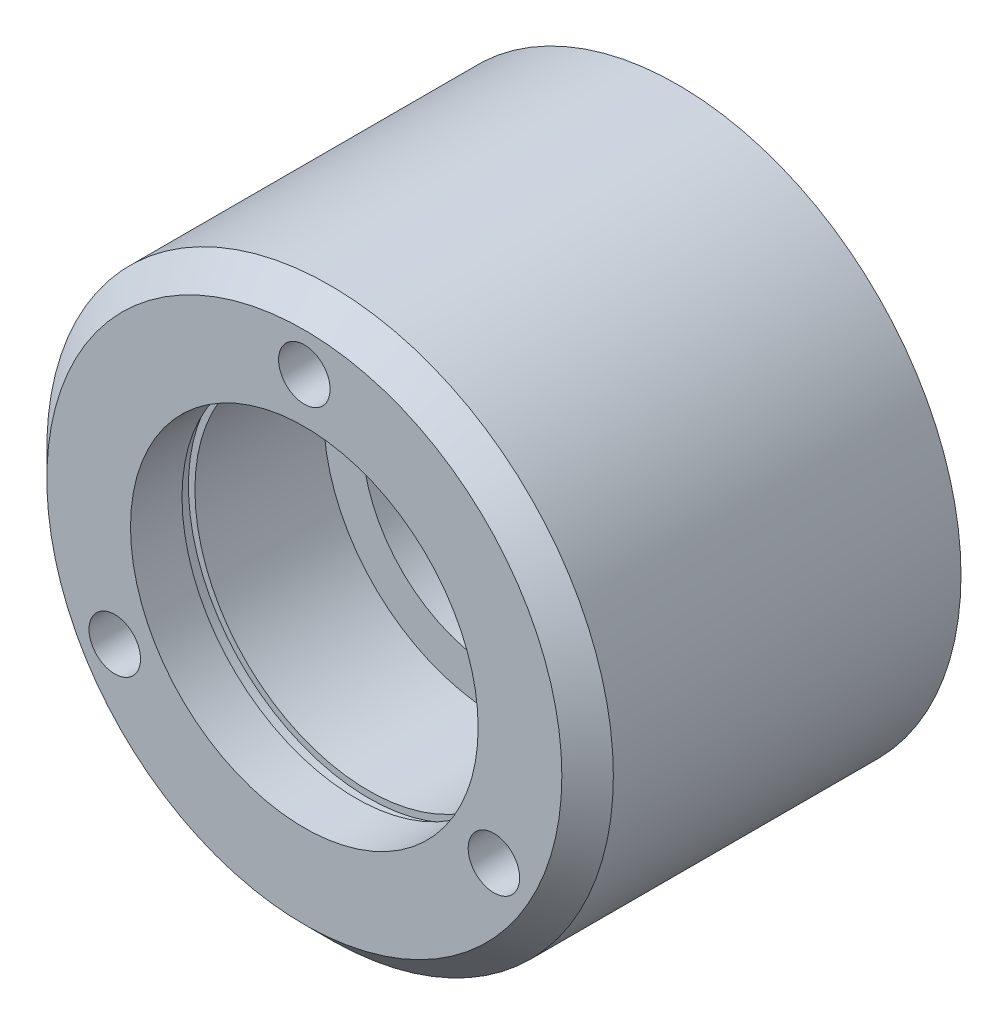
ISO-10303-21;
HEADER;
FILE_DESCRIPTION(('STEP AP214'),'2;1');
FILE_NAME('part.step','',(''),(''),'','','');
FILE_SCHEMA(('AUTOMOTIVE_DESIGN { 1 0 10303 214 1 1 1 1 }'));
ENDSEC;
DATA;
#1=APPLICATION_CONTEXT('core data for automotive mechanical design processes');
#2=APPLICATION_PROTOCOL_DEFINITION('international standard','automotive_design',2000,#1);
#3=PRODUCT_CONTEXT('',#1,'mechanical');
#4=PRODUCT('Part','Part','',(#3));
#5=PRODUCT_RELATED_PRODUCT_CATEGORY('part','',(#4));
#6=PRODUCT_DEFINITION_FORMATION('','',#4);
#7=PRODUCT_DEFINITION_CONTEXT('part definition',#1,'design');
#8=PRODUCT_DEFINITION('design','',#6,#7);
#9=PRODUCT_DEFINITION_SHAPE('','',#8);
#10=(LENGTH_UNIT() NAMED_UNIT(*) SI_UNIT(.MILLI.,.METRE.));
#11=(NAMED_UNIT(*) PLANE_ANGLE_UNIT() SI_UNIT($,.RADIAN.));
#12=(NAMED_UNIT(*) SI_UNIT($,.STERADIAN.) SOLID_ANGLE_UNIT());
#13=UNCERTAINTY_MEASURE_WITH_UNIT(LENGTH_MEASURE(1.E-05),#10,'distance_accuracy_value','');
#14=(GEOMETRIC_REPRESENTATION_CONTEXT(3) GLOBAL_UNCERTAINTY_ASSIGNED_CONTEXT((#13)) GLOBAL_UNIT_ASSIGNED_CONTEXT((#10,
#11,#12)) REPRESENTATION_CONTEXT('',''));
#15=CARTESIAN_POINT('',(0.,0.,0.));
#16=DIRECTION('',(0.,0.,1.));
#17=DIRECTION('',(1.,0.,0.));
#18=AXIS2_PLACEMENT_3D('',#15,#16,#17);
#19=CARTESIAN_POINT('',(0.,0.,12.));
#20=DIRECTION('',(0.,0.,1.));
#21=DIRECTION('',(1.,0.,0.));
#22=AXIS2_PLACEMENT_3D('',#19,#20,#21);
#23=PLANE('',#22);
#24=CARTESIAN_POINT('',(0.,0.,12.));
#25=DIRECTION('',(0.,0.,1.));
#26=DIRECTION('',(1.,0.,0.));
#27=AXIS2_PLACEMENT_3D('',#24,#25,#26);
#28=CIRCLE('',#27,6.75);
#29=CARTESIAN_POINT('',(6.75,0.,12.));
#30=VERTEX_POINT('',#29);
#31=EDGE_CURVE('E79',#30,#30,#28,.T.);
#32=ORIENTED_EDGE('',*,*,#31,.F.);
#33=EDGE_LOOP('',(#32));
#34=FACE_BOUND('',#33,.T.);
#35=CARTESIAN_POINT('',(0.,0.,12.));
#36=DIRECTION('',(0.,0.,1.));
#37=DIRECTION('',(1.,0.,0.));
#38=AXIS2_PLACEMENT_3D('',#35,#36,#37);
#39=CIRCLE('',#38,7.);
#40=CARTESIAN_POINT('',(7.,0.,12.));
#41=VERTEX_POINT('',#40);
#42=EDGE_CURVE('E87',#41,#41,#39,.T.);
#43=ORIENTED_EDGE('',*,*,#42,.T.);
#44=EDGE_LOOP('',(#43));
#45=FACE_BOUND('',#44,.T.);
#46=ADVANCED_FACE('F53',(#34,#45),#23,.T.);
#47=CARTESIAN_POINT('',(0.,0.,7.));
#48=DIRECTION('',(0.,0.,1.));
#49=DIRECTION('',(1.,0.,0.));
#50=AXIS2_PLACEMENT_3D('',#47,#48,#49);
#51=PLANE('',#50);
#52=CARTESIAN_POINT('',(0.,0.,7.));
#53=DIRECTION('',(0.,0.,1.));
#54=DIRECTION('',(1.,0.,0.));
#55=AXIS2_PLACEMENT_3D('',#52,#53,#54);
#56=CIRCLE('',#55,5.25);
#57=CARTESIAN_POINT('',(5.25,0.,7.));
#58=VERTEX_POINT('',#57);
#59=EDGE_CURVE('E72',#58,#58,#56,.T.);
#60=ORIENTED_EDGE('',*,*,#59,.F.);
#61=EDGE_LOOP('',(#60));
#62=FACE_BOUND('',#61,.T.);
#63=CARTESIAN_POINT('',(0.,0.,7.));
#64=DIRECTION('',(0.,0.,1.));
#65=DIRECTION('',(1.,0.,0.));
#66=AXIS2_PLACEMENT_3D('',#63,#64,#65);
#67=CIRCLE('',#66,6.75);
#68=CARTESIAN_POINT('',(6.75,0.,7.));
#69=VERTEX_POINT('',#68);
#70=EDGE_CURVE('E83',#69,#69,#67,.T.);
#71=ORIENTED_EDGE('',*,*,#70,.T.);
#72=EDGE_LOOP('',(#71));
#73=FACE_BOUND('',#72,.T.);
#74=ADVANCED_FACE('F137',(#62,#73),#51,.T.);
#75=CARTESIAN_POINT('',(0.,0.,0.));
#76=DIRECTION('',(0.,0.,1.));
#77=DIRECTION('',(1.,0.,0.));
#78=AXIS2_PLACEMENT_3D('',#75,#76,#77);
#79=PLANE('',#78);
#80=CARTESIAN_POINT('',(0.,8.5,0.));
#81=DIRECTION('',(0.,0.,-1.));
#82=DIRECTION('',(-1.,0.,0.));
#83=AXIS2_PLACEMENT_3D('',#80,#81,#82);
#84=CIRCLE('',#83,0.999999999999987);
#85=CARTESIAN_POINT('',(-0.999999999999987,8.5,0.));
#86=VERTEX_POINT('',#85);
#87=EDGE_CURVE('E126',#86,#86,#84,.T.);
#88=ORIENTED_EDGE('',*,*,#87,.F.);
#89=EDGE_LOOP('',(#88));
#90=FACE_BOUND('',#89,.T.);
#91=CARTESIAN_POINT('',(-7.36121593216771,-4.25000000000003,0.));
#92=DIRECTION('',(0.,0.,-1.));
#93=DIRECTION('',(-1.,0.,0.));
#94=AXIS2_PLACEMENT_3D('',#91,#92,#93);
#95=CIRCLE('',#94,0.999999999999987);
#96=CARTESIAN_POINT('',(-8.3612159321677,-4.25000000000003,0.));
#97=VERTEX_POINT('',#96);
#98=EDGE_CURVE('E118',#97,#97,#95,.T.);
#99=ORIENTED_EDGE('',*,*,#98,.F.);
#100=EDGE_LOOP('',(#99));
#101=FACE_BOUND('',#100,.T.);
#102=CARTESIAN_POINT('',(7.36121593216777,-4.24999999999993,0.));
#103=DIRECTION('',(0.,0.,-1.));
#104=DIRECTION('',(-1.,0.,0.));
#105=AXIS2_PLACEMENT_3D('',#102,#103,#104);
#106=CIRCLE('',#105,0.999999999999986);
#107=CARTESIAN_POINT('',(6.36121593216778,-4.24999999999993,0.));
#108=VERTEX_POINT('',#107);
#109=EDGE_CURVE('E110',#108,#108,#106,.T.);
#110=ORIENTED_EDGE('',*,*,#109,.F.);
#111=EDGE_LOOP('',(#110));
#112=FACE_BOUND('',#111,.T.);
#113=CARTESIAN_POINT('',(0.,0.,0.));
#114=DIRECTION('',(0.,0.,1.));
#115=DIRECTION('',(1.,0.,0.));
#116=AXIS2_PLACEMENT_3D('',#113,#114,#115);
#117=CIRCLE('',#116,11.);
#118=CARTESIAN_POINT('',(11.,0.,0.));
#119=VERTEX_POINT('',#118);
#120=EDGE_CURVE('E67',#119,#119,#117,.T.);
#121=ORIENTED_EDGE('',*,*,#120,.F.);
#122=EDGE_LOOP('',(#121));
#123=FACE_BOUND('',#122,.T.);
#124=CARTESIAN_POINT('',(0.,0.,0.));
#125=DIRECTION('',(0.,0.,1.));
#126=DIRECTION('',(1.,0.,0.));
#127=AXIS2_PLACEMENT_3D('',#124,#125,#126);
#128=CIRCLE('',#127,5.25);
#129=CARTESIAN_POINT('',(5.25,0.,0.));
#130=VERTEX_POINT('',#129);
#131=EDGE_CURVE('E75',#130,#130,#128,.T.);
#132=ORIENTED_EDGE('',*,*,#131,.T.);
#133=EDGE_LOOP('',(#132));
#134=FACE_BOUND('',#133,.T.);
#135=ADVANCED_FACE('F133',(#90,#101,#112,#123,#134),#79,.F.);
#136=CARTESIAN_POINT('',(0.,0.,7.));
#137=DIRECTION('',(0.,0.,-1.));
#138=DIRECTION('',(-1.,0.,0.));
#139=AXIS2_PLACEMENT_3D('',#136,#137,#138);
#140=CYLINDRICAL_SURFACE('',#139,11.);
#141=CARTESIAN_POINT('',(0.,0.,13.5));
#142=DIRECTION('',(0.,0.,1.));
#143=DIRECTION('',(1.,0.,0.));
#144=AXIS2_PLACEMENT_3D('',#141,#142,#143);
#145=CIRCLE('',#144,11.);
#146=CARTESIAN_POINT('',(11.,0.,13.5));
#147=VERTEX_POINT('',#146);
#148=EDGE_CURVE('E10',#147,#147,#145,.F.);
#149=ORIENTED_EDGE('',*,*,#148,.T.);
#150=EDGE_LOOP('',(#149));
#151=FACE_BOUND('',#150,.T.);
#152=ORIENTED_EDGE('',*,*,#120,.T.);
#153=EDGE_LOOP('',(#152));
#154=FACE_BOUND('',#153,.T.);
#155=ADVANCED_FACE('F136',(#151,#154),#140,.T.);
#156=CARTESIAN_POINT('',(0.,0.,7.));
#157=DIRECTION('',(0.,0.,-1.));
#158=DIRECTION('',(-1.,0.,0.));
#159=AXIS2_PLACEMENT_3D('',#156,#157,#158);
#160=CYLINDRICAL_SURFACE('',#159,5.25);
#161=ORIENTED_EDGE('',*,*,#59,.T.);
#162=EDGE_LOOP('',(#161));
#163=FACE_BOUND('',#162,.T.);
#164=ORIENTED_EDGE('',*,*,#131,.F.);
#165=EDGE_LOOP('',(#164));
#166=FACE_BOUND('',#165,.T.);
#167=ADVANCED_FACE('F147',(#163,#166),#160,.F.);
#168=CARTESIAN_POINT('',(0.,0.,12.));
#169=DIRECTION('',(0.,0.,-1.));
#170=DIRECTION('',(-1.,0.,0.));
#171=AXIS2_PLACEMENT_3D('',#168,#169,#170);
#172=CYLINDRICAL_SURFACE('',#171,6.75);
#173=ORIENTED_EDGE('',*,*,#31,.T.);
#174=EDGE_LOOP('',(#173));
#175=FACE_BOUND('',#174,.T.);
#176=ORIENTED_EDGE('',*,*,#70,.F.);
#177=EDGE_LOOP('',(#176));
#178=FACE_BOUND('',#177,.T.);
#179=ADVANCED_FACE('F149',(#175,#178),#172,.F.);
#180=CARTESIAN_POINT('',(0.,0.,12.5));
#181=DIRECTION('',(0.,0.,-1.));
#182=DIRECTION('',(-1.,0.,0.));
#183=AXIS2_PLACEMENT_3D('',#180,#181,#182);
#184=CYLINDRICAL_SURFACE('',#183,7.);
#185=CARTESIAN_POINT('',(0.,0.,12.5));
#186=DIRECTION('',(0.,0.,1.));
#187=DIRECTION('',(1.,0.,0.));
#188=AXIS2_PLACEMENT_3D('',#185,#186,#187);
#189=CIRCLE('',#188,7.);
#190=CARTESIAN_POINT('',(7.,0.,12.5));
#191=VERTEX_POINT('',#190);
#192=EDGE_CURVE('E94',#191,#191,#189,.T.);
#193=ORIENTED_EDGE('',*,*,#192,.T.);
#194=EDGE_LOOP('',(#193));
#195=FACE_BOUND('',#194,.T.);
#196=ORIENTED_EDGE('',*,*,#42,.F.);
#197=EDGE_LOOP('',(#196));
#198=FACE_BOUND('',#197,.T.);
#199=ADVANCED_FACE('F156',(#195,#198),#184,.F.);
#200=CARTESIAN_POINT('',(0.,0.,12.5));
#201=DIRECTION('',(0.,0.,1.));
#202=DIRECTION('',(1.,0.,0.));
#203=AXIS2_PLACEMENT_3D('',#200,#201,#202);
#204=PLANE('',#203);
#205=CARTESIAN_POINT('',(0.,0.,12.5));
#206=DIRECTION('',(0.,0.,1.));
#207=DIRECTION('',(1.,0.,0.));
#208=AXIS2_PLACEMENT_3D('',#205,#206,#207);
#209=CIRCLE('',#208,6.75);
#210=CARTESIAN_POINT('',(6.75,0.,12.5));
#211=VERTEX_POINT('',#210);
#212=EDGE_CURVE('E99',#211,#211,#209,.T.);
#213=ORIENTED_EDGE('',*,*,#212,.T.);
#214=EDGE_LOOP('',(#213));
#215=FACE_BOUND('',#214,.T.);
#216=ORIENTED_EDGE('',*,*,#192,.F.);
#217=EDGE_LOOP('',(#216));
#218=FACE_BOUND('',#217,.T.);
#219=ADVANCED_FACE('F172',(#215,#218),#204,.F.);
#220=CARTESIAN_POINT('',(0.,0.,14.5));
#221=DIRECTION('',(0.,0.,1.));
#222=DIRECTION('',(1.,0.,0.));
#223=AXIS2_PLACEMENT_3D('',#220,#221,#222);
#224=PLANE('',#223);
#225=CARTESIAN_POINT('',(0.,8.5,14.5));
#226=DIRECTION('',(0.,0.,-1.));
#227=DIRECTION('',(-1.,0.,0.));
#228=AXIS2_PLACEMENT_3D('',#225,#226,#227);
#229=CIRCLE('',#228,0.999999999999997);
#230=CARTESIAN_POINT('',(-0.999999999999997,8.5,14.5));
#231=VERTEX_POINT('',#230);
#232=EDGE_CURVE('E122',#231,#231,#229,.T.);
#233=ORIENTED_EDGE('',*,*,#232,.T.);
#234=EDGE_LOOP('',(#233));
#235=FACE_BOUND('',#234,.T.);
#236=CARTESIAN_POINT('',(-7.36121593216771,-4.25000000000003,14.5));
#237=DIRECTION('',(0.,0.,-1.));
#238=DIRECTION('',(-1.,0.,0.));
#239=AXIS2_PLACEMENT_3D('',#236,#237,#238);
#240=CIRCLE('',#239,0.999999999999997);
#241=CARTESIAN_POINT('',(-8.36121593216771,-4.25000000000003,14.5));
#242=VERTEX_POINT('',#241);
#243=EDGE_CURVE('E114',#242,#242,#240,.T.);
#244=ORIENTED_EDGE('',*,*,#243,.T.);
#245=EDGE_LOOP('',(#244));
#246=FACE_BOUND('',#245,.T.);
#247=CARTESIAN_POINT('',(7.36121593216777,-4.24999999999993,14.5));
#248=DIRECTION('',(0.,0.,-1.));
#249=DIRECTION('',(-1.,0.,0.));
#250=AXIS2_PLACEMENT_3D('',#247,#248,#249);
#251=CIRCLE('',#250,0.999999999999997);
#252=CARTESIAN_POINT('',(6.36121593216777,-4.24999999999993,14.5));
#253=VERTEX_POINT('',#252);
#254=EDGE_CURVE('E103',#253,#253,#251,.T.);
#255=ORIENTED_EDGE('',*,*,#254,.T.);
#256=EDGE_LOOP('',(#255));
#257=FACE_BOUND('',#256,.T.);
#258=CARTESIAN_POINT('',(0.,0.,14.5));
#259=DIRECTION('',(0.,0.,1.));
#260=DIRECTION('',(1.,0.,0.));
#261=AXIS2_PLACEMENT_3D('',#258,#259,#260);
#262=CIRCLE('',#261,10.);
#263=CARTESIAN_POINT('',(10.,0.,14.5));
#264=VERTEX_POINT('',#263);
#265=EDGE_CURVE('E62',#264,#264,#262,.T.);
#266=ORIENTED_EDGE('',*,*,#265,.T.);
#267=EDGE_LOOP('',(#266));
#268=FACE_BOUND('',#267,.T.);
#269=CARTESIAN_POINT('',(0.,0.,14.5));
#270=DIRECTION('',(0.,0.,1.));
#271=DIRECTION('',(1.,0.,0.));
#272=AXIS2_PLACEMENT_3D('',#269,#270,#271);
#273=CIRCLE('',#272,6.75);
#274=CARTESIAN_POINT('',(6.75,0.,14.5));
#275=VERTEX_POINT('',#274);
#276=EDGE_CURVE('E98',#275,#275,#273,.T.);
#277=ORIENTED_EDGE('',*,*,#276,.F.);
#278=EDGE_LOOP('',(#277));
#279=FACE_BOUND('',#278,.T.);
#280=ADVANCED_FACE('F176',(#235,#246,#257,#268,#279),#224,.T.);
#281=CARTESIAN_POINT('',(0.,0.,14.5));
#282=DIRECTION('',(0.,0.,-1.));
#283=DIRECTION('',(-1.,0.,0.));
#284=AXIS2_PLACEMENT_3D('',#281,#282,#283);
#285=CYLINDRICAL_SURFACE('',#284,6.75);
#286=ORIENTED_EDGE('',*,*,#276,.T.);
#287=EDGE_LOOP('',(#286));
#288=FACE_BOUND('',#287,.T.);
#289=ORIENTED_EDGE('',*,*,#212,.F.);
#290=EDGE_LOOP('',(#289));
#291=FACE_BOUND('',#290,.T.);
#292=ADVANCED_FACE('F180',(#288,#291),#285,.F.);
#293=CARTESIAN_POINT('',(0.,0.,14.5));
#294=DIRECTION('',(0.,0.,-1.));
#295=DIRECTION('',(-1.,0.,0.));
#296=AXIS2_PLACEMENT_3D('',#293,#294,#295);
#297=CONICAL_SURFACE('',#296,10.,0.785398163397448);
#298=ORIENTED_EDGE('',*,*,#148,.F.);
#299=EDGE_LOOP('',(#298));
#300=FACE_BOUND('',#299,.T.);
#301=ORIENTED_EDGE('',*,*,#265,.F.);
#302=EDGE_LOOP('',(#301));
#303=FACE_BOUND('',#302,.T.);
#304=ADVANCED_FACE('F56',(#300,#303),#297,.T.);
#305=CARTESIAN_POINT('',(7.36121593216777,-4.24999999999993,0.));
#306=DIRECTION('',(0.,0.,-1.));
#307=DIRECTION('',(-1.,0.,0.));
#308=AXIS2_PLACEMENT_3D('',#305,#306,#307);
#309=CYLINDRICAL_SURFACE('',#308,0.999999999999991);
#310=ORIENTED_EDGE('',*,*,#254,.F.);
#311=EDGE_LOOP('',(#310));
#312=FACE_BOUND('',#311,.T.);
#313=ORIENTED_EDGE('',*,*,#109,.T.);
#314=EDGE_LOOP('',(#313));
#315=FACE_BOUND('',#314,.T.);
#316=ADVANCED_FACE('F185',(#312,#315),#309,.F.);
#317=CARTESIAN_POINT('',(-7.36121593216771,-4.25000000000003,0.));
#318=DIRECTION('',(0.,0.,-1.));
#319=DIRECTION('',(-1.,0.,0.));
#320=AXIS2_PLACEMENT_3D('',#317,#318,#319);
#321=CYLINDRICAL_SURFACE('',#320,0.999999999999992);
#322=ORIENTED_EDGE('',*,*,#243,.F.);
#323=EDGE_LOOP('',(#322));
#324=FACE_BOUND('',#323,.T.);
#325=ORIENTED_EDGE('',*,*,#98,.T.);
#326=EDGE_LOOP('',(#325));
#327=FACE_BOUND('',#326,.T.);
#328=ADVANCED_FACE('F188',(#324,#327),#321,.F.);
#329=CARTESIAN_POINT('',(0.,8.5,0.));
#330=DIRECTION('',(0.,0.,-1.));
#331=DIRECTION('',(-1.,0.,0.));
#332=AXIS2_PLACEMENT_3D('',#329,#330,#331);
#333=CYLINDRICAL_SURFACE('',#332,0.999999999999992);
#334=ORIENTED_EDGE('',*,*,#232,.F.);
#335=EDGE_LOOP('',(#334));
#336=FACE_BOUND('',#335,.T.);
#337=ORIENTED_EDGE('',*,*,#87,.T.);
#338=EDGE_LOOP('',(#337));
#339=FACE_BOUND('',#338,.T.);
#340=ADVANCED_FACE('F131',(#336,#339),#333,.F.);
#341=CLOSED_SHELL('',(#46,#74,#135,#155,#167,#179,#199,#219,#280,#292,#304,#316,#328,#340));
#342=MANIFOLD_SOLID_BREP('B2',#341);
#343=ADVANCED_BREP_SHAPE_REPRESENTATION('',(#18,#342),#14);
#344=SHAPE_DEFINITION_REPRESENTATION(#9,#343);
ENDSEC;
END-ISO-10303-21;
